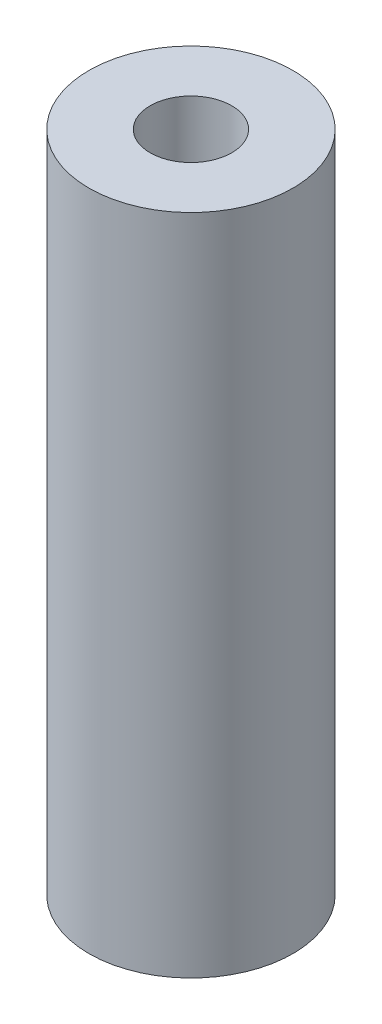
ISO-10303-21;
HEADER;
FILE_DESCRIPTION(('STEP AP214'),'2;1');
FILE_NAME('part.step','',(''),(''),'','','');
FILE_SCHEMA(('AUTOMOTIVE_DESIGN { 1 0 10303 214 1 1 1 1 }'));
ENDSEC;
DATA;
#1=APPLICATION_CONTEXT('core data for automotive mechanical design processes');
#2=APPLICATION_PROTOCOL_DEFINITION('international standard','automotive_design',2000,#1);
#3=PRODUCT_CONTEXT('',#1,'mechanical');
#4=PRODUCT('Part','Part','',(#3));
#5=PRODUCT_RELATED_PRODUCT_CATEGORY('part','',(#4));
#6=PRODUCT_DEFINITION_FORMATION('','',#4);
#7=PRODUCT_DEFINITION_CONTEXT('part definition',#1,'design');
#8=PRODUCT_DEFINITION('design','',#6,#7);
#9=PRODUCT_DEFINITION_SHAPE('','',#8);
#10=(LENGTH_UNIT() NAMED_UNIT(*) SI_UNIT(.MILLI.,.METRE.));
#11=(NAMED_UNIT(*) PLANE_ANGLE_UNIT() SI_UNIT($,.RADIAN.));
#12=(NAMED_UNIT(*) SI_UNIT($,.STERADIAN.) SOLID_ANGLE_UNIT());
#13=UNCERTAINTY_MEASURE_WITH_UNIT(LENGTH_MEASURE(1.E-05),#10,'distance_accuracy_value','');
#14=(GEOMETRIC_REPRESENTATION_CONTEXT(3) GLOBAL_UNCERTAINTY_ASSIGNED_CONTEXT((#13)) GLOBAL_UNIT_ASSIGNED_CONTEXT((#10,
#11,#12)) REPRESENTATION_CONTEXT('',''));
#15=CARTESIAN_POINT('',(0.,0.,0.));
#16=DIRECTION('',(0.,0.,1.));
#17=DIRECTION('',(1.,0.,0.));
#18=AXIS2_PLACEMENT_3D('',#15,#16,#17);
#19=CARTESIAN_POINT('',(0.,65.,0.));
#20=DIRECTION('',(0.,1.,0.));
#21=DIRECTION('',(0.,0.,1.));
#22=AXIS2_PLACEMENT_3D('',#19,#20,#21);
#23=PLANE('',#22);
#24=CARTESIAN_POINT('',(0.,65.,0.));
#25=DIRECTION('',(0.,1.,0.));
#26=DIRECTION('',(0.,0.,1.));
#27=AXIS2_PLACEMENT_3D('',#24,#25,#26);
#28=CIRCLE('',#27,10.);
#29=CARTESIAN_POINT('',(0.,65.,10.));
#30=VERTEX_POINT('',#29);
#31=EDGE_CURVE('E10',#30,#30,#28,.T.);
#32=ORIENTED_EDGE('',*,*,#31,.T.);
#33=EDGE_LOOP('',(#32));
#34=FACE_BOUND('',#33,.T.);
#35=CARTESIAN_POINT('',(0.,65.,0.));
#36=DIRECTION('',(0.,1.,0.));
#37=DIRECTION('',(0.,0.,1.));
#38=AXIS2_PLACEMENT_3D('',#35,#36,#37);
#39=CIRCLE('',#38,4.);
#40=CARTESIAN_POINT('',(0.,65.,4.));
#41=VERTEX_POINT('',#40);
#42=EDGE_CURVE('E44',#41,#41,#39,.T.);
#43=ORIENTED_EDGE('',*,*,#42,.F.);
#44=EDGE_LOOP('',(#43));
#45=FACE_BOUND('',#44,.T.);
#46=ADVANCED_FACE('F33',(#34,#45),#23,.T.);
#47=CARTESIAN_POINT('',(0.,0.,0.));
#48=DIRECTION('',(0.,1.,0.));
#49=DIRECTION('',(0.,0.,1.));
#50=AXIS2_PLACEMENT_3D('',#47,#48,#49);
#51=PLANE('',#50);
#52=CARTESIAN_POINT('',(0.,0.,0.));
#53=DIRECTION('',(0.,1.,0.));
#54=DIRECTION('',(0.,0.,1.));
#55=AXIS2_PLACEMENT_3D('',#52,#53,#54);
#56=CIRCLE('',#55,10.);
#57=CARTESIAN_POINT('',(0.,0.,10.));
#58=VERTEX_POINT('',#57);
#59=EDGE_CURVE('E37',#58,#58,#56,.T.);
#60=ORIENTED_EDGE('',*,*,#59,.F.);
#61=EDGE_LOOP('',(#60));
#62=FACE_BOUND('',#61,.T.);
#63=CARTESIAN_POINT('',(0.,0.,0.));
#64=DIRECTION('',(0.,1.,0.));
#65=DIRECTION('',(0.,0.,1.));
#66=AXIS2_PLACEMENT_3D('',#63,#64,#65);
#67=CIRCLE('',#66,4.);
#68=CARTESIAN_POINT('',(0.,0.,4.));
#69=VERTEX_POINT('',#68);
#70=EDGE_CURVE('E46',#69,#69,#67,.T.);
#71=ORIENTED_EDGE('',*,*,#70,.T.);
#72=EDGE_LOOP('',(#71));
#73=FACE_BOUND('',#72,.T.);
#74=ADVANCED_FACE('F56',(#62,#73),#51,.F.);
#75=CARTESIAN_POINT('',(0.,65.,0.));
#76=DIRECTION('',(0.,-1.,0.));
#77=DIRECTION('',(0.,0.,-1.));
#78=AXIS2_PLACEMENT_3D('',#75,#76,#77);
#79=CYLINDRICAL_SURFACE('',#78,10.);
#80=ORIENTED_EDGE('',*,*,#31,.F.);
#81=EDGE_LOOP('',(#80));
#82=FACE_BOUND('',#81,.T.);
#83=ORIENTED_EDGE('',*,*,#59,.T.);
#84=EDGE_LOOP('',(#83));
#85=FACE_BOUND('',#84,.T.);
#86=ADVANCED_FACE('F35',(#82,#85),#79,.T.);
#87=CARTESIAN_POINT('',(0.,65.,0.));
#88=DIRECTION('',(0.,-1.,0.));
#89=DIRECTION('',(0.,0.,-1.));
#90=AXIS2_PLACEMENT_3D('',#87,#88,#89);
#91=CYLINDRICAL_SURFACE('',#90,4.);
#92=ORIENTED_EDGE('',*,*,#42,.T.);
#93=EDGE_LOOP('',(#92));
#94=FACE_BOUND('',#93,.T.);
#95=ORIENTED_EDGE('',*,*,#70,.F.);
#96=EDGE_LOOP('',(#95));
#97=FACE_BOUND('',#96,.T.);
#98=ADVANCED_FACE('F52',(#94,#97),#91,.F.);
#99=CLOSED_SHELL('',(#46,#74,#86,#98));
#100=MANIFOLD_SOLID_BREP('B2',#99);
#101=ADVANCED_BREP_SHAPE_REPRESENTATION('',(#18,#100),#14);
#102=SHAPE_DEFINITION_REPRESENTATION(#9,#101);
ENDSEC;
END-ISO-10303-21;
